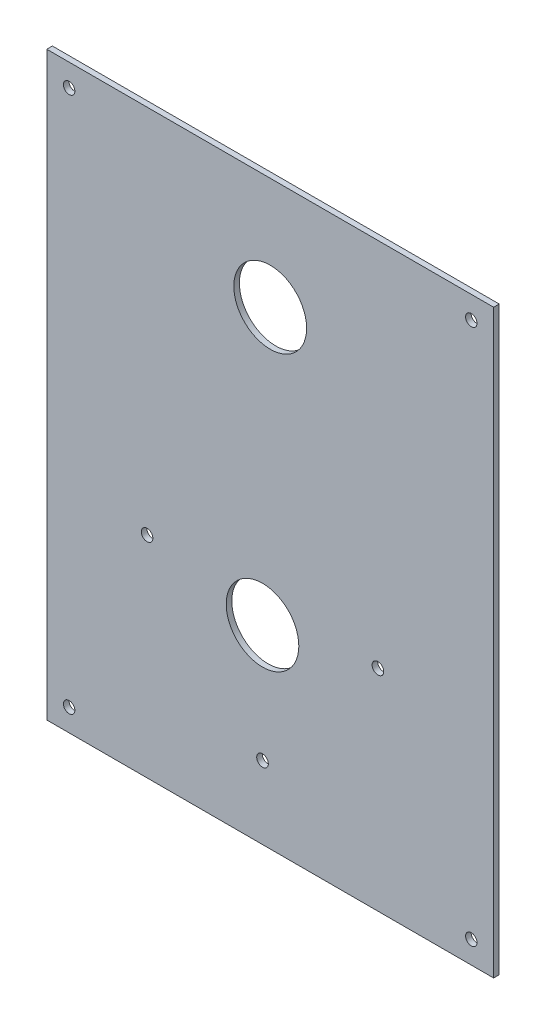
ISO-10303-21;
HEADER;
FILE_DESCRIPTION(('STEP AP214'),'2;1');
FILE_NAME('part.step','',(''),(''),'','','');
FILE_SCHEMA(('AUTOMOTIVE_DESIGN { 1 0 10303 214 1 1 1 1 }'));
ENDSEC;
DATA;
#1=APPLICATION_CONTEXT('core data for automotive mechanical design processes');
#2=APPLICATION_PROTOCOL_DEFINITION('international standard','automotive_design',2000,#1);
#3=PRODUCT_CONTEXT('',#1,'mechanical');
#4=PRODUCT('Part','Part','',(#3));
#5=PRODUCT_RELATED_PRODUCT_CATEGORY('part','',(#4));
#6=PRODUCT_DEFINITION_FORMATION('','',#4);
#7=PRODUCT_DEFINITION_CONTEXT('part definition',#1,'design');
#8=PRODUCT_DEFINITION('design','',#6,#7);
#9=PRODUCT_DEFINITION_SHAPE('','',#8);
#10=(LENGTH_UNIT() NAMED_UNIT(*) SI_UNIT(.MILLI.,.METRE.));
#11=(NAMED_UNIT(*) PLANE_ANGLE_UNIT() SI_UNIT($,.RADIAN.));
#12=(NAMED_UNIT(*) SI_UNIT($,.STERADIAN.) SOLID_ANGLE_UNIT());
#13=UNCERTAINTY_MEASURE_WITH_UNIT(LENGTH_MEASURE(1.E-05),#10,'distance_accuracy_value','');
#14=(GEOMETRIC_REPRESENTATION_CONTEXT(3) GLOBAL_UNCERTAINTY_ASSIGNED_CONTEXT((#13)) GLOBAL_UNIT_ASSIGNED_CONTEXT((#10,
#11,#12)) REPRESENTATION_CONTEXT('',''));
#15=CARTESIAN_POINT('',(0.,0.,0.));
#16=DIRECTION('',(0.,0.,1.));
#17=DIRECTION('',(1.,0.,0.));
#18=AXIS2_PLACEMENT_3D('',#15,#16,#17);
#19=CARTESIAN_POINT('',(-107.018593613324,68.3908085902847,-3.175));
#20=DIRECTION('',(-1.,0.,0.));
#21=DIRECTION('',(0.,-1.,0.));
#22=AXIS2_PLACEMENT_3D('',#19,#20,#21);
#23=PLANE('',#22);
#24=DIRECTION('',(0.,-1.,0.));
#25=VECTOR('',#24,1.);
#26=CARTESIAN_POINT('',(-107.018593613324,68.3908085902847,0.));
#27=LINE('',#26,#25);
#28=CARTESIAN_POINT('',(-107.018593613324,68.3908085902847,0.));
#29=VERTEX_POINT('',#28);
#30=CARTESIAN_POINT('',(-107.018593613324,-261.809191409715,0.));
#31=VERTEX_POINT('',#30);
#32=EDGE_CURVE('E102',#29,#31,#27,.T.);
#33=ORIENTED_EDGE('',*,*,#32,.F.);
#34=DIRECTION('',(0.,0.,1.));
#35=VECTOR('',#34,1.);
#36=CARTESIAN_POINT('',(-107.018593613324,68.3908085902847,-3.175));
#37=LINE('',#36,#35);
#38=CARTESIAN_POINT('',(-107.018593613324,68.3908085902847,-3.175));
#39=VERTEX_POINT('',#38);
#40=EDGE_CURVE('E11',#39,#29,#37,.T.);
#41=ORIENTED_EDGE('',*,*,#40,.F.);
#42=DIRECTION('',(0.,-1.,0.));
#43=VECTOR('',#42,1.);
#44=CARTESIAN_POINT('',(-107.018593613324,68.3908085902847,-3.175));
#45=LINE('',#44,#43);
#46=CARTESIAN_POINT('',(-107.018593613324,-261.809191409715,-3.175));
#47=VERTEX_POINT('',#46);
#48=EDGE_CURVE('E95',#39,#47,#45,.T.);
#49=ORIENTED_EDGE('',*,*,#48,.T.);
#50=DIRECTION('',(0.,0.,1.));
#51=VECTOR('',#50,1.);
#52=CARTESIAN_POINT('',(-107.018593613324,-261.809191409715,-3.175));
#53=LINE('',#52,#51);
#54=EDGE_CURVE('E40',#47,#31,#53,.T.);
#55=ORIENTED_EDGE('',*,*,#54,.T.);
#56=EDGE_LOOP('',(#33,#41,#49,#55));
#57=FACE_BOUND('',#56,.T.);
#58=ADVANCED_FACE('F37',(#57),#23,.T.);
#59=CARTESIAN_POINT('',(146.981406386676,68.3908085902848,-3.175));
#60=DIRECTION('',(0.,1.,0.));
#61=DIRECTION('',(-1.,0.,0.));
#62=AXIS2_PLACEMENT_3D('',#59,#60,#61);
#63=PLANE('',#62);
#64=DIRECTION('',(-1.,0.,0.));
#65=VECTOR('',#64,1.);
#66=CARTESIAN_POINT('',(146.981406386676,68.3908085902848,0.));
#67=LINE('',#66,#65);
#68=CARTESIAN_POINT('',(146.981406386676,68.3908085902848,0.));
#69=VERTEX_POINT('',#68);
#70=EDGE_CURVE('E97',#69,#29,#67,.T.);
#71=ORIENTED_EDGE('',*,*,#70,.F.);
#72=DIRECTION('',(0.,0.,1.));
#73=VECTOR('',#72,1.);
#74=CARTESIAN_POINT('',(146.981406386676,68.3908085902848,-3.175));
#75=LINE('',#74,#73);
#76=CARTESIAN_POINT('',(146.981406386676,68.3908085902848,-3.175));
#77=VERTEX_POINT('',#76);
#78=EDGE_CURVE('E46',#77,#69,#75,.T.);
#79=ORIENTED_EDGE('',*,*,#78,.F.);
#80=DIRECTION('',(-1.,0.,0.));
#81=VECTOR('',#80,1.);
#82=CARTESIAN_POINT('',(146.981406386676,68.3908085902848,-3.175));
#83=LINE('',#82,#81);
#84=EDGE_CURVE('E92',#77,#39,#83,.T.);
#85=ORIENTED_EDGE('',*,*,#84,.T.);
#86=ORIENTED_EDGE('',*,*,#40,.T.);
#87=EDGE_LOOP('',(#71,#79,#85,#86));
#88=FACE_BOUND('',#87,.T.);
#89=ADVANCED_FACE('F113',(#88),#63,.T.);
#90=CARTESIAN_POINT('',(146.981406386676,-261.809191409715,-3.175));
#91=DIRECTION('',(1.,0.,0.));
#92=DIRECTION('',(0.,1.,0.));
#93=AXIS2_PLACEMENT_3D('',#90,#91,#92);
#94=PLANE('',#93);
#95=DIRECTION('',(0.,1.,0.));
#96=VECTOR('',#95,1.);
#97=CARTESIAN_POINT('',(146.981406386676,-261.809191409715,0.));
#98=LINE('',#97,#96);
#99=CARTESIAN_POINT('',(146.981406386676,-261.809191409715,0.));
#100=VERTEX_POINT('',#99);
#101=EDGE_CURVE('E87',#100,#69,#98,.T.);
#102=ORIENTED_EDGE('',*,*,#101,.F.);
#103=DIRECTION('',(0.,0.,1.));
#104=VECTOR('',#103,1.);
#105=CARTESIAN_POINT('',(146.981406386676,-261.809191409715,-3.175));
#106=LINE('',#105,#104);
#107=CARTESIAN_POINT('',(146.981406386676,-261.809191409715,-3.175));
#108=VERTEX_POINT('',#107);
#109=EDGE_CURVE('E82',#108,#100,#106,.T.);
#110=ORIENTED_EDGE('',*,*,#109,.F.);
#111=DIRECTION('',(0.,1.,0.));
#112=VECTOR('',#111,1.);
#113=CARTESIAN_POINT('',(146.981406386676,-261.809191409715,-3.175));
#114=LINE('',#113,#112);
#115=EDGE_CURVE('E85',#108,#77,#114,.T.);
#116=ORIENTED_EDGE('',*,*,#115,.T.);
#117=ORIENTED_EDGE('',*,*,#78,.T.);
#118=EDGE_LOOP('',(#102,#110,#116,#117));
#119=FACE_BOUND('',#118,.T.);
#120=ADVANCED_FACE('F84',(#119),#94,.T.);
#121=CARTESIAN_POINT('',(-107.018593613324,-261.809191409715,-3.175));
#122=DIRECTION('',(0.,-1.,0.));
#123=DIRECTION('',(0.,0.,-1.));
#124=AXIS2_PLACEMENT_3D('',#121,#122,#123);
#125=PLANE('',#124);
#126=DIRECTION('',(1.,0.,0.));
#127=VECTOR('',#126,1.);
#128=CARTESIAN_POINT('',(-107.018593613324,-261.809191409715,0.));
#129=LINE('',#128,#127);
#130=EDGE_CURVE('E105',#31,#100,#129,.T.);
#131=ORIENTED_EDGE('',*,*,#130,.F.);
#132=ORIENTED_EDGE('',*,*,#54,.F.);
#133=DIRECTION('',(1.,0.,0.));
#134=VECTOR('',#133,1.);
#135=CARTESIAN_POINT('',(-107.018593613324,-261.809191409715,-3.175));
#136=LINE('',#135,#134);
#137=EDGE_CURVE('E91',#47,#108,#136,.T.);
#138=ORIENTED_EDGE('',*,*,#137,.T.);
#139=ORIENTED_EDGE('',*,*,#109,.T.);
#140=EDGE_LOOP('',(#131,#132,#138,#139));
#141=FACE_BOUND('',#140,.T.);
#142=ADVANCED_FACE('F94',(#141),#125,.T.);
#143=CARTESIAN_POINT('',(0.,0.,-3.175));
#144=DIRECTION('',(0.,0.,1.));
#145=DIRECTION('',(1.,0.,0.));
#146=AXIS2_PLACEMENT_3D('',#143,#144,#145);
#147=PLANE('',#146);
#148=CARTESIAN_POINT('',(134.281406386676,55.6908085902848,-3.175));
#149=DIRECTION('',(0.,0.,1.));
#150=DIRECTION('',(1.,0.,0.));
#151=AXIS2_PLACEMENT_3D('',#148,#149,#150);
#152=CIRCLE('',#151,3.25120000000001);
#153=CARTESIAN_POINT('',(137.532606386676,55.6908085902848,-3.175));
#154=VERTEX_POINT('',#153);
#155=EDGE_CURVE('E190',#154,#154,#152,.T.);
#156=ORIENTED_EDGE('',*,*,#155,.T.);
#157=EDGE_LOOP('',(#156));
#158=FACE_BOUND('',#157,.T.);
#159=CARTESIAN_POINT('',(15.6054208522582,-153.798867351796,-3.175));
#160=DIRECTION('',(0.,0.,1.));
#161=DIRECTION('',(1.,0.,0.));
#162=AXIS2_PLACEMENT_3D('',#159,#160,#161);
#163=CIRCLE('',#162,20.6375);
#164=CARTESIAN_POINT('',(36.2429208522582,-153.798867351796,-3.175));
#165=VERTEX_POINT('',#164);
#166=EDGE_CURVE('E200',#165,#165,#163,.T.);
#167=ORIENTED_EDGE('',*,*,#166,.T.);
#168=EDGE_LOOP('',(#167));
#169=FACE_BOUND('',#168,.T.);
#170=CARTESIAN_POINT('',(15.6054208522239,-220.423867351796,-3.175));
#171=DIRECTION('',(0.,0.,1.));
#172=DIRECTION('',(1.,0.,0.));
#173=AXIS2_PLACEMENT_3D('',#170,#171,#172);
#174=CIRCLE('',#173,3.29999999998449);
#175=CARTESIAN_POINT('',(18.9054208522084,-220.423867351796,-3.175));
#176=VERTEX_POINT('',#175);
#177=EDGE_CURVE('E199',#176,#176,#174,.T.);
#178=ORIENTED_EDGE('',*,*,#177,.T.);
#179=EDGE_LOOP('',(#178));
#180=FACE_BOUND('',#179,.T.);
#181=CARTESIAN_POINT('',(81.2182373967086,-142.229557514805,-3.175));
#182=DIRECTION('',(0.,0.,1.));
#183=DIRECTION('',(1.,0.,0.));
#184=AXIS2_PLACEMENT_3D('',#181,#182,#183);
#185=CIRCLE('',#184,3.29999999996842);
#186=CARTESIAN_POINT('',(84.518237396677,-142.229557514805,-3.175));
#187=VERTEX_POINT('',#186);
#188=EDGE_CURVE('E211',#187,#187,#185,.T.);
#189=ORIENTED_EDGE('',*,*,#188,.T.);
#190=EDGE_LOOP('',(#189));
#191=FACE_BOUND('',#190,.T.);
#192=CARTESIAN_POINT('',(-94.3185936133241,-249.109191409715,-3.175));
#193=DIRECTION('',(0.,0.,1.));
#194=DIRECTION('',(1.,0.,0.));
#195=AXIS2_PLACEMENT_3D('',#192,#193,#194);
#196=CIRCLE('',#195,3.25119999999999);
#197=CARTESIAN_POINT('',(-91.0673936133241,-249.109191409715,-3.175));
#198=VERTEX_POINT('',#197);
#199=EDGE_CURVE('E175',#198,#198,#196,.T.);
#200=ORIENTED_EDGE('',*,*,#199,.T.);
#201=EDGE_LOOP('',(#200));
#202=FACE_BOUND('',#201,.T.);
#203=CARTESIAN_POINT('',(134.281406386676,-249.109191409715,-3.175));
#204=DIRECTION('',(0.,0.,1.));
#205=DIRECTION('',(1.,0.,0.));
#206=AXIS2_PLACEMENT_3D('',#203,#204,#205);
#207=CIRCLE('',#206,3.25120000000001);
#208=CARTESIAN_POINT('',(137.532606386676,-249.109191409715,-3.175));
#209=VERTEX_POINT('',#208);
#210=EDGE_CURVE('E180',#209,#209,#207,.T.);
#211=ORIENTED_EDGE('',*,*,#210,.T.);
#212=EDGE_LOOP('',(#211));
#213=FACE_BOUND('',#212,.T.);
#214=CARTESIAN_POINT('',(-94.3185936133241,55.6908085902848,-3.175));
#215=DIRECTION('',(0.,0.,1.));
#216=DIRECTION('',(1.,0.,0.));
#217=AXIS2_PLACEMENT_3D('',#214,#215,#216);
#218=CIRCLE('',#217,3.25119999999999);
#219=CARTESIAN_POINT('',(-91.0673936133241,55.6908085902848,-3.175));
#220=VERTEX_POINT('',#219);
#221=EDGE_CURVE('E191',#220,#220,#218,.T.);
#222=ORIENTED_EDGE('',*,*,#221,.T.);
#223=EDGE_LOOP('',(#222));
#224=FACE_BOUND('',#223,.T.);
#225=CARTESIAN_POINT('',(-50.0073956921802,-142.229557514737,-3.175));
#226=DIRECTION('',(0.,0.,1.));
#227=DIRECTION('',(1.,0.,0.));
#228=AXIS2_PLACEMENT_3D('',#225,#226,#227);
#229=CIRCLE('',#228,3.3);
#230=CARTESIAN_POINT('',(-46.7073956921801,-142.229557514737,-3.175));
#231=VERTEX_POINT('',#230);
#232=EDGE_CURVE('E219',#231,#231,#229,.T.);
#233=ORIENTED_EDGE('',*,*,#232,.T.);
#234=EDGE_LOOP('',(#233));
#235=FACE_BOUND('',#234,.T.);
#236=CARTESIAN_POINT('',(19.9814063866759,4.89080859028478,-3.175));
#237=DIRECTION('',(0.,0.,1.));
#238=DIRECTION('',(1.,0.,0.));
#239=AXIS2_PLACEMENT_3D('',#236,#237,#238);
#240=CIRCLE('',#239,20.701);
#241=CARTESIAN_POINT('',(40.6824063866759,4.89080859028478,-3.175));
#242=VERTEX_POINT('',#241);
#243=EDGE_CURVE('E106',#242,#242,#240,.T.);
#244=ORIENTED_EDGE('',*,*,#243,.T.);
#245=EDGE_LOOP('',(#244));
#246=FACE_BOUND('',#245,.T.);
#247=ORIENTED_EDGE('',*,*,#48,.F.);
#248=ORIENTED_EDGE('',*,*,#84,.F.);
#249=ORIENTED_EDGE('',*,*,#115,.F.);
#250=ORIENTED_EDGE('',*,*,#137,.F.);
#251=EDGE_LOOP('',(#247,#248,#249,#250));
#252=FACE_BOUND('',#251,.T.);
#253=ADVANCED_FACE('F90',(#158,#169,#180,#191,#202,#213,#224,#235,#246,#252),#147,.F.);
#254=CARTESIAN_POINT('',(0.,0.,0.));
#255=DIRECTION('',(0.,0.,1.));
#256=DIRECTION('',(1.,0.,0.));
#257=AXIS2_PLACEMENT_3D('',#254,#255,#256);
#258=PLANE('',#257);
#259=CARTESIAN_POINT('',(134.281406386676,55.6908085902848,0.));
#260=DIRECTION('',(0.,0.,1.));
#261=DIRECTION('',(1.,0.,0.));
#262=AXIS2_PLACEMENT_3D('',#259,#260,#261);
#263=CIRCLE('',#262,3.25120000000001);
#264=CARTESIAN_POINT('',(137.532606386676,55.6908085902848,0.));
#265=VERTEX_POINT('',#264);
#266=EDGE_CURVE('E203',#265,#265,#263,.T.);
#267=ORIENTED_EDGE('',*,*,#266,.F.);
#268=EDGE_LOOP('',(#267));
#269=FACE_BOUND('',#268,.T.);
#270=CARTESIAN_POINT('',(15.6054208522582,-153.798867351796,0.));
#271=DIRECTION('',(0.,0.,1.));
#272=DIRECTION('',(1.,0.,0.));
#273=AXIS2_PLACEMENT_3D('',#270,#271,#272);
#274=CIRCLE('',#273,20.6375);
#275=CARTESIAN_POINT('',(36.2429208522582,-153.798867351796,0.));
#276=VERTEX_POINT('',#275);
#277=EDGE_CURVE('E196',#276,#276,#274,.T.);
#278=ORIENTED_EDGE('',*,*,#277,.F.);
#279=EDGE_LOOP('',(#278));
#280=FACE_BOUND('',#279,.T.);
#281=CARTESIAN_POINT('',(15.6054208522239,-220.423867351796,0.));
#282=DIRECTION('',(0.,0.,1.));
#283=DIRECTION('',(1.,0.,0.));
#284=AXIS2_PLACEMENT_3D('',#281,#282,#283);
#285=CIRCLE('',#284,3.29999999998449);
#286=CARTESIAN_POINT('',(18.9054208522084,-220.423867351796,0.));
#287=VERTEX_POINT('',#286);
#288=EDGE_CURVE('E214',#287,#287,#285,.T.);
#289=ORIENTED_EDGE('',*,*,#288,.F.);
#290=EDGE_LOOP('',(#289));
#291=FACE_BOUND('',#290,.T.);
#292=CARTESIAN_POINT('',(81.2182373967086,-142.229557514805,0.));
#293=DIRECTION('',(0.,0.,1.));
#294=DIRECTION('',(1.,0.,0.));
#295=AXIS2_PLACEMENT_3D('',#292,#293,#294);
#296=CIRCLE('',#295,3.29999999996842);
#297=CARTESIAN_POINT('',(84.518237396677,-142.229557514805,0.));
#298=VERTEX_POINT('',#297);
#299=EDGE_CURVE('E207',#298,#298,#296,.T.);
#300=ORIENTED_EDGE('',*,*,#299,.F.);
#301=EDGE_LOOP('',(#300));
#302=FACE_BOUND('',#301,.T.);
#303=CARTESIAN_POINT('',(-94.3185936133241,-249.109191409715,0.));
#304=DIRECTION('',(0.,0.,1.));
#305=DIRECTION('',(1.,0.,0.));
#306=AXIS2_PLACEMENT_3D('',#303,#304,#305);
#307=CIRCLE('',#306,3.25119999999999);
#308=CARTESIAN_POINT('',(-91.0673936133241,-249.109191409715,0.));
#309=VERTEX_POINT('',#308);
#310=EDGE_CURVE('E178',#309,#309,#307,.T.);
#311=ORIENTED_EDGE('',*,*,#310,.F.);
#312=EDGE_LOOP('',(#311));
#313=FACE_BOUND('',#312,.T.);
#314=CARTESIAN_POINT('',(134.281406386676,-249.109191409715,0.));
#315=DIRECTION('',(0.,0.,1.));
#316=DIRECTION('',(1.,0.,0.));
#317=AXIS2_PLACEMENT_3D('',#314,#315,#316);
#318=CIRCLE('',#317,3.25120000000001);
#319=CARTESIAN_POINT('',(137.532606386676,-249.109191409715,0.));
#320=VERTEX_POINT('',#319);
#321=EDGE_CURVE('E183',#320,#320,#318,.T.);
#322=ORIENTED_EDGE('',*,*,#321,.F.);
#323=EDGE_LOOP('',(#322));
#324=FACE_BOUND('',#323,.T.);
#325=CARTESIAN_POINT('',(-94.3185936133241,55.6908085902848,0.));
#326=DIRECTION('',(0.,0.,1.));
#327=DIRECTION('',(1.,0.,0.));
#328=AXIS2_PLACEMENT_3D('',#325,#326,#327);
#329=CIRCLE('',#328,3.25119999999999);
#330=CARTESIAN_POINT('',(-91.0673936133241,55.6908085902848,0.));
#331=VERTEX_POINT('',#330);
#332=EDGE_CURVE('E187',#331,#331,#329,.T.);
#333=ORIENTED_EDGE('',*,*,#332,.F.);
#334=EDGE_LOOP('',(#333));
#335=FACE_BOUND('',#334,.T.);
#336=CARTESIAN_POINT('',(-50.0073956921802,-142.229557514737,0.));
#337=DIRECTION('',(0.,0.,1.));
#338=DIRECTION('',(1.,0.,0.));
#339=AXIS2_PLACEMENT_3D('',#336,#337,#338);
#340=CIRCLE('',#339,3.3);
#341=CARTESIAN_POINT('',(-46.7073956921801,-142.229557514737,0.));
#342=VERTEX_POINT('',#341);
#343=EDGE_CURVE('E210',#342,#342,#340,.T.);
#344=ORIENTED_EDGE('',*,*,#343,.F.);
#345=EDGE_LOOP('',(#344));
#346=FACE_BOUND('',#345,.T.);
#347=CARTESIAN_POINT('',(19.9814063866759,4.89080859028478,0.));
#348=DIRECTION('',(0.,0.,1.));
#349=DIRECTION('',(1.,0.,0.));
#350=AXIS2_PLACEMENT_3D('',#347,#348,#349);
#351=CIRCLE('',#350,20.701);
#352=CARTESIAN_POINT('',(40.6824063866759,4.89080859028478,0.));
#353=VERTEX_POINT('',#352);
#354=EDGE_CURVE('E222',#353,#353,#351,.T.);
#355=ORIENTED_EDGE('',*,*,#354,.F.);
#356=EDGE_LOOP('',(#355));
#357=FACE_BOUND('',#356,.T.);
#358=ORIENTED_EDGE('',*,*,#32,.T.);
#359=ORIENTED_EDGE('',*,*,#130,.T.);
#360=ORIENTED_EDGE('',*,*,#101,.T.);
#361=ORIENTED_EDGE('',*,*,#70,.T.);
#362=EDGE_LOOP('',(#358,#359,#360,#361));
#363=FACE_BOUND('',#362,.T.);
#364=ADVANCED_FACE('F112',(#269,#280,#291,#302,#313,#324,#335,#346,#357,#363),#258,.T.);
#365=CARTESIAN_POINT('',(19.9814063866759,4.89080859028478,-3.175));
#366=DIRECTION('',(0.,0.,1.));
#367=DIRECTION('',(1.,0.,0.));
#368=AXIS2_PLACEMENT_3D('',#365,#366,#367);
#369=CYLINDRICAL_SURFACE('',#368,20.701);
#370=ORIENTED_EDGE('',*,*,#243,.F.);
#371=EDGE_LOOP('',(#370));
#372=FACE_BOUND('',#371,.T.);
#373=ORIENTED_EDGE('',*,*,#354,.T.);
#374=EDGE_LOOP('',(#373));
#375=FACE_BOUND('',#374,.T.);
#376=ADVANCED_FACE('F131',(#372,#375),#369,.F.);
#377=CARTESIAN_POINT('',(-50.0073956921802,-142.229557514737,-3.175));
#378=DIRECTION('',(0.,0.,1.));
#379=DIRECTION('',(1.,0.,0.));
#380=AXIS2_PLACEMENT_3D('',#377,#378,#379);
#381=CYLINDRICAL_SURFACE('',#380,3.3);
#382=ORIENTED_EDGE('',*,*,#232,.F.);
#383=EDGE_LOOP('',(#382));
#384=FACE_BOUND('',#383,.T.);
#385=ORIENTED_EDGE('',*,*,#343,.T.);
#386=EDGE_LOOP('',(#385));
#387=FACE_BOUND('',#386,.T.);
#388=ADVANCED_FACE('F138',(#384,#387),#381,.F.);
#389=CARTESIAN_POINT('',(-94.3185936133241,55.6908085902848,-3.175));
#390=DIRECTION('',(0.,0.,1.));
#391=DIRECTION('',(1.,0.,0.));
#392=AXIS2_PLACEMENT_3D('',#389,#390,#391);
#393=CYLINDRICAL_SURFACE('',#392,3.25119999999999);
#394=ORIENTED_EDGE('',*,*,#221,.F.);
#395=EDGE_LOOP('',(#394));
#396=FACE_BOUND('',#395,.T.);
#397=ORIENTED_EDGE('',*,*,#332,.T.);
#398=EDGE_LOOP('',(#397));
#399=FACE_BOUND('',#398,.T.);
#400=ADVANCED_FACE('F142',(#396,#399),#393,.F.);
#401=CARTESIAN_POINT('',(134.281406386676,-249.109191409715,-3.175));
#402=DIRECTION('',(0.,0.,1.));
#403=DIRECTION('',(1.,0.,0.));
#404=AXIS2_PLACEMENT_3D('',#401,#402,#403);
#405=CYLINDRICAL_SURFACE('',#404,3.25120000000001);
#406=ORIENTED_EDGE('',*,*,#210,.F.);
#407=EDGE_LOOP('',(#406));
#408=FACE_BOUND('',#407,.T.);
#409=ORIENTED_EDGE('',*,*,#321,.T.);
#410=EDGE_LOOP('',(#409));
#411=FACE_BOUND('',#410,.T.);
#412=ADVANCED_FACE('F161',(#408,#411),#405,.F.);
#413=CARTESIAN_POINT('',(-94.3185936133241,-249.109191409715,-3.175));
#414=DIRECTION('',(0.,0.,1.));
#415=DIRECTION('',(1.,0.,0.));
#416=AXIS2_PLACEMENT_3D('',#413,#414,#415);
#417=CYLINDRICAL_SURFACE('',#416,3.25119999999999);
#418=ORIENTED_EDGE('',*,*,#199,.F.);
#419=EDGE_LOOP('',(#418));
#420=FACE_BOUND('',#419,.T.);
#421=ORIENTED_EDGE('',*,*,#310,.T.);
#422=EDGE_LOOP('',(#421));
#423=FACE_BOUND('',#422,.T.);
#424=ADVANCED_FACE('F152',(#420,#423),#417,.F.);
#425=CARTESIAN_POINT('',(81.2182373967086,-142.229557514805,-3.175));
#426=DIRECTION('',(0.,0.,1.));
#427=DIRECTION('',(1.,0.,0.));
#428=AXIS2_PLACEMENT_3D('',#425,#426,#427);
#429=CYLINDRICAL_SURFACE('',#428,3.29999999996842);
#430=ORIENTED_EDGE('',*,*,#188,.F.);
#431=EDGE_LOOP('',(#430));
#432=FACE_BOUND('',#431,.T.);
#433=ORIENTED_EDGE('',*,*,#299,.T.);
#434=EDGE_LOOP('',(#433));
#435=FACE_BOUND('',#434,.T.);
#436=ADVANCED_FACE('F148',(#432,#435),#429,.F.);
#437=CARTESIAN_POINT('',(15.6054208522239,-220.423867351796,-3.175));
#438=DIRECTION('',(0.,0.,1.));
#439=DIRECTION('',(1.,0.,0.));
#440=AXIS2_PLACEMENT_3D('',#437,#438,#439);
#441=CYLINDRICAL_SURFACE('',#440,3.29999999998449);
#442=ORIENTED_EDGE('',*,*,#177,.F.);
#443=EDGE_LOOP('',(#442));
#444=FACE_BOUND('',#443,.T.);
#445=ORIENTED_EDGE('',*,*,#288,.T.);
#446=EDGE_LOOP('',(#445));
#447=FACE_BOUND('',#446,.T.);
#448=ADVANCED_FACE('F144',(#444,#447),#441,.F.);
#449=CARTESIAN_POINT('',(15.6054208522582,-153.798867351796,-3.175));
#450=DIRECTION('',(0.,0.,1.));
#451=DIRECTION('',(1.,0.,0.));
#452=AXIS2_PLACEMENT_3D('',#449,#450,#451);
#453=CYLINDRICAL_SURFACE('',#452,20.6375);
#454=ORIENTED_EDGE('',*,*,#166,.F.);
#455=EDGE_LOOP('',(#454));
#456=FACE_BOUND('',#455,.T.);
#457=ORIENTED_EDGE('',*,*,#277,.T.);
#458=EDGE_LOOP('',(#457));
#459=FACE_BOUND('',#458,.T.);
#460=ADVANCED_FACE('F147',(#456,#459),#453,.F.);
#461=CARTESIAN_POINT('',(134.281406386676,55.6908085902848,-3.175));
#462=DIRECTION('',(0.,0.,1.));
#463=DIRECTION('',(1.,0.,0.));
#464=AXIS2_PLACEMENT_3D('',#461,#462,#463);
#465=CYLINDRICAL_SURFACE('',#464,3.25120000000001);
#466=ORIENTED_EDGE('',*,*,#155,.F.);
#467=EDGE_LOOP('',(#466));
#468=FACE_BOUND('',#467,.T.);
#469=ORIENTED_EDGE('',*,*,#266,.T.);
#470=EDGE_LOOP('',(#469));
#471=FACE_BOUND('',#470,.T.);
#472=ADVANCED_FACE('F154',(#468,#471),#465,.F.);
#473=CLOSED_SHELL('',(#58,#89,#120,#142,#253,#364,#376,#388,#400,#412,#424,#436,#448,#460,#472));
#474=MANIFOLD_SOLID_BREP('B2',#473);
#475=ADVANCED_BREP_SHAPE_REPRESENTATION('',(#18,#474),#14);
#476=SHAPE_DEFINITION_REPRESENTATION(#9,#475);
ENDSEC;
END-ISO-10303-21;
